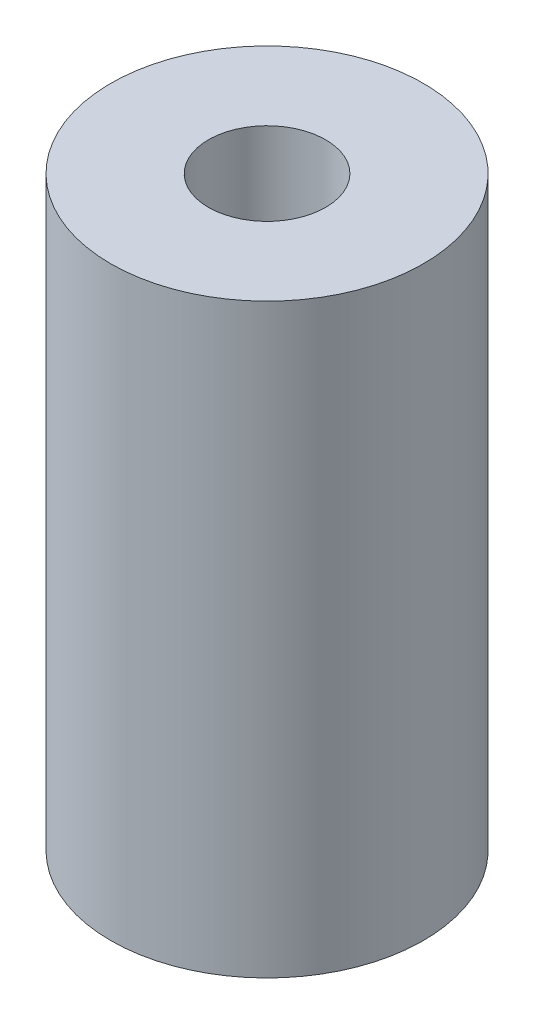
ISO-10303-21;
HEADER;
FILE_DESCRIPTION(('STEP AP214'),'2;1');
FILE_NAME('part.step','',(''),(''),'','','');
FILE_SCHEMA(('AUTOMOTIVE_DESIGN { 1 0 10303 214 1 1 1 1 }'));
ENDSEC;
DATA;
#1=APPLICATION_CONTEXT('core data for automotive mechanical design processes');
#2=APPLICATION_PROTOCOL_DEFINITION('international standard','automotive_design',2000,#1);
#3=PRODUCT_CONTEXT('',#1,'mechanical');
#4=PRODUCT('Part','Part','',(#3));
#5=PRODUCT_RELATED_PRODUCT_CATEGORY('part','',(#4));
#6=PRODUCT_DEFINITION_FORMATION('','',#4);
#7=PRODUCT_DEFINITION_CONTEXT('part definition',#1,'design');
#8=PRODUCT_DEFINITION('design','',#6,#7);
#9=PRODUCT_DEFINITION_SHAPE('','',#8);
#10=(LENGTH_UNIT() NAMED_UNIT(*) SI_UNIT(.MILLI.,.METRE.));
#11=(NAMED_UNIT(*) PLANE_ANGLE_UNIT() SI_UNIT($,.RADIAN.));
#12=(NAMED_UNIT(*) SI_UNIT($,.STERADIAN.) SOLID_ANGLE_UNIT());
#13=UNCERTAINTY_MEASURE_WITH_UNIT(LENGTH_MEASURE(1.E-05),#10,'distance_accuracy_value','');
#14=(GEOMETRIC_REPRESENTATION_CONTEXT(3) GLOBAL_UNCERTAINTY_ASSIGNED_CONTEXT((#13)) GLOBAL_UNIT_ASSIGNED_CONTEXT((#10,
#11,#12)) REPRESENTATION_CONTEXT('',''));
#15=CARTESIAN_POINT('',(0.,0.,0.));
#16=DIRECTION('',(0.,0.,1.));
#17=DIRECTION('',(1.,0.,0.));
#18=AXIS2_PLACEMENT_3D('',#15,#16,#17);
#19=CARTESIAN_POINT('',(0.,15.,0.));
#20=DIRECTION('',(0.,1.,0.));
#21=DIRECTION('',(0.,0.,1.));
#22=AXIS2_PLACEMENT_3D('',#19,#20,#21);
#23=PLANE('',#22);
#24=CARTESIAN_POINT('',(0.,15.,0.));
#25=DIRECTION('',(0.,1.,0.));
#26=DIRECTION('',(0.,0.,1.));
#27=AXIS2_PLACEMENT_3D('',#24,#25,#26);
#28=CIRCLE('',#27,4.);
#29=CARTESIAN_POINT('',(0.,15.,4.));
#30=VERTEX_POINT('',#29);
#31=EDGE_CURVE('E11',#30,#30,#28,.T.);
#32=ORIENTED_EDGE('',*,*,#31,.T.);
#33=EDGE_LOOP('',(#32));
#34=FACE_BOUND('',#33,.T.);
#35=CARTESIAN_POINT('',(0.,15.,0.));
#36=DIRECTION('',(0.,1.,0.));
#37=DIRECTION('',(0.,0.,1.));
#38=AXIS2_PLACEMENT_3D('',#35,#36,#37);
#39=CIRCLE('',#38,1.5);
#40=CARTESIAN_POINT('',(0.,15.,1.5));
#41=VERTEX_POINT('',#40);
#42=EDGE_CURVE('E48',#41,#41,#39,.T.);
#43=ORIENTED_EDGE('',*,*,#42,.F.);
#44=EDGE_LOOP('',(#43));
#45=FACE_BOUND('',#44,.T.);
#46=ADVANCED_FACE('F37',(#34,#45),#23,.T.);
#47=CARTESIAN_POINT('',(0.,0.,0.));
#48=DIRECTION('',(0.,1.,0.));
#49=DIRECTION('',(0.,0.,1.));
#50=AXIS2_PLACEMENT_3D('',#47,#48,#49);
#51=PLANE('',#50);
#52=CARTESIAN_POINT('',(0.,0.,0.));
#53=DIRECTION('',(0.,1.,0.));
#54=DIRECTION('',(0.,0.,1.));
#55=AXIS2_PLACEMENT_3D('',#52,#53,#54);
#56=CIRCLE('',#55,4.);
#57=CARTESIAN_POINT('',(0.,0.,4.));
#58=VERTEX_POINT('',#57);
#59=EDGE_CURVE('E41',#58,#58,#56,.T.);
#60=ORIENTED_EDGE('',*,*,#59,.F.);
#61=EDGE_LOOP('',(#60));
#62=FACE_BOUND('',#61,.T.);
#63=CARTESIAN_POINT('',(0.,0.,0.));
#64=DIRECTION('',(0.,1.,0.));
#65=DIRECTION('',(0.,0.,1.));
#66=AXIS2_PLACEMENT_3D('',#63,#64,#65);
#67=CIRCLE('',#66,1.5);
#68=CARTESIAN_POINT('',(0.,0.,1.5));
#69=VERTEX_POINT('',#68);
#70=EDGE_CURVE('E50',#69,#69,#67,.T.);
#71=ORIENTED_EDGE('',*,*,#70,.T.);
#72=EDGE_LOOP('',(#71));
#73=FACE_BOUND('',#72,.T.);
#74=ADVANCED_FACE('F60',(#62,#73),#51,.F.);
#75=CARTESIAN_POINT('',(0.,15.,0.));
#76=DIRECTION('',(0.,-1.,0.));
#77=DIRECTION('',(0.,0.,-1.));
#78=AXIS2_PLACEMENT_3D('',#75,#76,#77);
#79=CYLINDRICAL_SURFACE('',#78,4.);
#80=ORIENTED_EDGE('',*,*,#31,.F.);
#81=EDGE_LOOP('',(#80));
#82=FACE_BOUND('',#81,.T.);
#83=ORIENTED_EDGE('',*,*,#59,.T.);
#84=EDGE_LOOP('',(#83));
#85=FACE_BOUND('',#84,.T.);
#86=ADVANCED_FACE('F39',(#82,#85),#79,.T.);
#87=CARTESIAN_POINT('',(0.,15.,0.));
#88=DIRECTION('',(0.,-1.,0.));
#89=DIRECTION('',(0.,0.,-1.));
#90=AXIS2_PLACEMENT_3D('',#87,#88,#89);
#91=CYLINDRICAL_SURFACE('',#90,1.5);
#92=ORIENTED_EDGE('',*,*,#42,.T.);
#93=EDGE_LOOP('',(#92));
#94=FACE_BOUND('',#93,.T.);
#95=ORIENTED_EDGE('',*,*,#70,.F.);
#96=EDGE_LOOP('',(#95));
#97=FACE_BOUND('',#96,.T.);
#98=ADVANCED_FACE('F56',(#94,#97),#91,.F.);
#99=CLOSED_SHELL('',(#46,#74,#86,#98));
#100=MANIFOLD_SOLID_BREP('B2',#99);
#101=ADVANCED_BREP_SHAPE_REPRESENTATION('',(#18,#100),#14);
#102=SHAPE_DEFINITION_REPRESENTATION(#9,#101);
ENDSEC;
END-ISO-10303-21;
